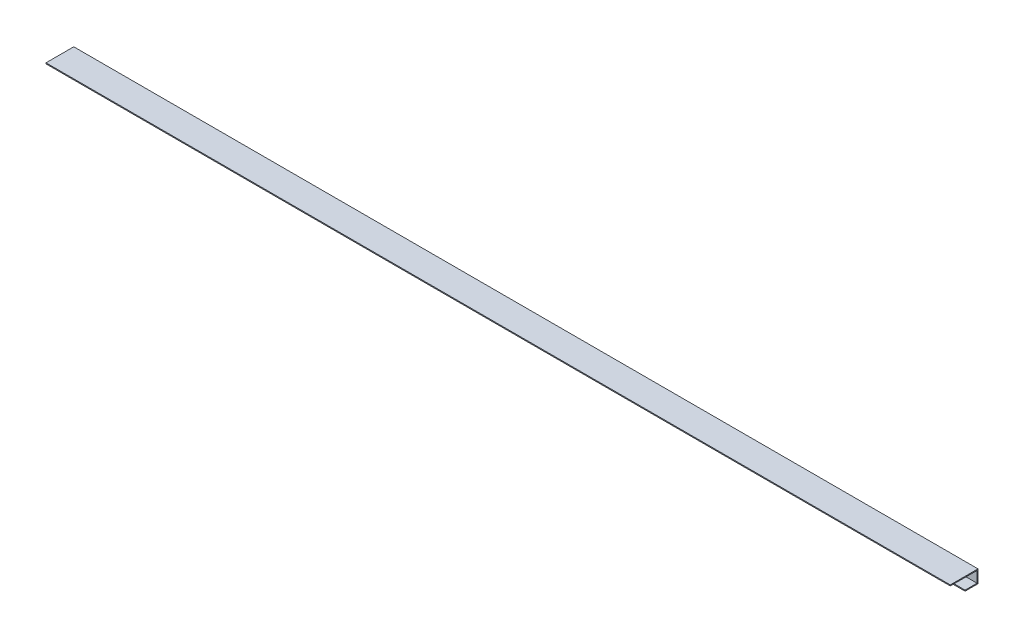
ISO-10303-21;
HEADER;
FILE_DESCRIPTION(('STEP AP214'),'2;1');
FILE_NAME('part.step','',(''),(''),'','','');
FILE_SCHEMA(('AUTOMOTIVE_DESIGN { 1 0 10303 214 1 1 1 1 }'));
ENDSEC;
DATA;
#1=APPLICATION_CONTEXT('core data for automotive mechanical design processes');
#2=APPLICATION_PROTOCOL_DEFINITION('international standard','automotive_design',2000,#1);
#3=PRODUCT_CONTEXT('',#1,'mechanical');
#4=PRODUCT('Part','Part','',(#3));
#5=PRODUCT_RELATED_PRODUCT_CATEGORY('part','',(#4));
#6=PRODUCT_DEFINITION_FORMATION('','',#4);
#7=PRODUCT_DEFINITION_CONTEXT('part definition',#1,'design');
#8=PRODUCT_DEFINITION('design','',#6,#7);
#9=PRODUCT_DEFINITION_SHAPE('','',#8);
#10=(LENGTH_UNIT() NAMED_UNIT(*) SI_UNIT(.MILLI.,.METRE.));
#11=(NAMED_UNIT(*) PLANE_ANGLE_UNIT() SI_UNIT($,.RADIAN.));
#12=(NAMED_UNIT(*) SI_UNIT($,.STERADIAN.) SOLID_ANGLE_UNIT());
#13=UNCERTAINTY_MEASURE_WITH_UNIT(LENGTH_MEASURE(1.E-05),#10,'distance_accuracy_value','');
#14=(GEOMETRIC_REPRESENTATION_CONTEXT(3) GLOBAL_UNCERTAINTY_ASSIGNED_CONTEXT((#13)) GLOBAL_UNIT_ASSIGNED_CONTEXT((#10,
#11,#12)) REPRESENTATION_CONTEXT('',''));
#15=CARTESIAN_POINT('',(0.,0.,0.));
#16=DIRECTION('',(0.,0.,1.));
#17=DIRECTION('',(1.,0.,0.));
#18=AXIS2_PLACEMENT_3D('',#15,#16,#17);
#19=CARTESIAN_POINT('',(1890.,0.,0.));
#20=DIRECTION('',(0.,0.,-1.));
#21=DIRECTION('',(-1.,0.,0.));
#22=AXIS2_PLACEMENT_3D('',#19,#20,#21);
#23=PLANE('',#22);
#24=DIRECTION('',(0.,-1.,0.));
#25=VECTOR('',#24,1.);
#26=CARTESIAN_POINT('',(0.,0.,0.));
#27=LINE('',#26,#25);
#28=CARTESIAN_POINT('',(0.,0.,0.));
#29=VERTEX_POINT('',#28);
#30=CARTESIAN_POINT('',(0.,-2.,0.));
#31=VERTEX_POINT('',#30);
#32=EDGE_CURVE('E129',#29,#31,#27,.T.);
#33=ORIENTED_EDGE('',*,*,#32,.T.);
#34=DIRECTION('',(-1.,0.,0.));
#35=VECTOR('',#34,1.);
#36=CARTESIAN_POINT('',(1890.,-2.,0.));
#37=LINE('',#36,#35);
#38=CARTESIAN_POINT('',(1890.,-2.,0.));
#39=VERTEX_POINT('',#38);
#40=EDGE_CURVE('E11',#39,#31,#37,.T.);
#41=ORIENTED_EDGE('',*,*,#40,.F.);
#42=DIRECTION('',(0.,-1.,0.));
#43=VECTOR('',#42,1.);
#44=CARTESIAN_POINT('',(1890.,0.,0.));
#45=LINE('',#44,#43);
#46=CARTESIAN_POINT('',(1890.,0.,0.));
#47=VERTEX_POINT('',#46);
#48=EDGE_CURVE('E143',#47,#39,#45,.T.);
#49=ORIENTED_EDGE('',*,*,#48,.F.);
#50=DIRECTION('',(-1.,0.,0.));
#51=VECTOR('',#50,1.);
#52=CARTESIAN_POINT('',(1890.,0.,0.));
#53=LINE('',#52,#51);
#54=EDGE_CURVE('E125',#47,#29,#53,.T.);
#55=ORIENTED_EDGE('',*,*,#54,.T.);
#56=EDGE_LOOP('',(#33,#41,#49,#55));
#57=FACE_BOUND('',#56,.T.);
#58=ADVANCED_FACE('F33',(#57),#23,.F.);
#59=CARTESIAN_POINT('',(1890.,-2.,0.));
#60=DIRECTION('',(0.,1.,0.));
#61=DIRECTION('',(0.,0.,1.));
#62=AXIS2_PLACEMENT_3D('',#59,#60,#61);
#63=PLANE('',#62);
#64=DIRECTION('',(0.,0.,-1.));
#65=VECTOR('',#64,1.);
#66=CARTESIAN_POINT('',(0.,-2.,0.));
#67=LINE('',#66,#65);
#68=CARTESIAN_POINT('',(0.,-2.,-56.));
#69=VERTEX_POINT('',#68);
#70=EDGE_CURVE('E132',#31,#69,#67,.T.);
#71=ORIENTED_EDGE('',*,*,#70,.T.);
#72=DIRECTION('',(-1.,0.,0.));
#73=VECTOR('',#72,1.);
#74=CARTESIAN_POINT('',(1890.,-2.,-56.));
#75=LINE('',#74,#73);
#76=CARTESIAN_POINT('',(1890.,-2.,-56.));
#77=VERTEX_POINT('',#76);
#78=EDGE_CURVE('E41',#77,#69,#75,.T.);
#79=ORIENTED_EDGE('',*,*,#78,.F.);
#80=DIRECTION('',(0.,0.,-1.));
#81=VECTOR('',#80,1.);
#82=CARTESIAN_POINT('',(1890.,-2.,0.));
#83=LINE('',#82,#81);
#84=EDGE_CURVE('E92',#39,#77,#83,.T.);
#85=ORIENTED_EDGE('',*,*,#84,.F.);
#86=ORIENTED_EDGE('',*,*,#40,.T.);
#87=EDGE_LOOP('',(#71,#79,#85,#86));
#88=FACE_BOUND('',#87,.T.);
#89=ADVANCED_FACE('F178',(#88),#63,.F.);
#90=CARTESIAN_POINT('',(1890.,-2.,-56.));
#91=DIRECTION('',(0.,0.,-1.));
#92=DIRECTION('',(-1.,0.,0.));
#93=AXIS2_PLACEMENT_3D('',#90,#91,#92);
#94=PLANE('',#93);
#95=DIRECTION('',(0.,-1.,0.));
#96=VECTOR('',#95,1.);
#97=CARTESIAN_POINT('',(0.,-2.,-56.));
#98=LINE('',#97,#96);
#99=CARTESIAN_POINT('',(0.,-25.,-56.));
#100=VERTEX_POINT('',#99);
#101=EDGE_CURVE('E134',#69,#100,#98,.T.);
#102=ORIENTED_EDGE('',*,*,#101,.T.);
#103=DIRECTION('',(-1.,0.,0.));
#104=VECTOR('',#103,1.);
#105=CARTESIAN_POINT('',(1890.,-25.,-56.));
#106=LINE('',#105,#104);
#107=CARTESIAN_POINT('',(1890.,-25.,-56.));
#108=VERTEX_POINT('',#107);
#109=EDGE_CURVE('E150',#108,#100,#106,.T.);
#110=ORIENTED_EDGE('',*,*,#109,.F.);
#111=DIRECTION('',(0.,-1.,0.));
#112=VECTOR('',#111,1.);
#113=CARTESIAN_POINT('',(1890.,-2.,-56.));
#114=LINE('',#113,#112);
#115=EDGE_CURVE('E158',#77,#108,#114,.T.);
#116=ORIENTED_EDGE('',*,*,#115,.F.);
#117=ORIENTED_EDGE('',*,*,#78,.T.);
#118=EDGE_LOOP('',(#102,#110,#116,#117));
#119=FACE_BOUND('',#118,.T.);
#120=ADVANCED_FACE('F156',(#119),#94,.F.);
#121=CARTESIAN_POINT('',(1890.,-25.,-56.));
#122=DIRECTION('',(0.,-1.,0.));
#123=DIRECTION('',(0.,0.,-1.));
#124=AXIS2_PLACEMENT_3D('',#121,#122,#123);
#125=PLANE('',#124);
#126=DIRECTION('',(0.,0.,1.));
#127=VECTOR('',#126,1.);
#128=CARTESIAN_POINT('',(0.,-25.,-56.));
#129=LINE('',#128,#127);
#130=CARTESIAN_POINT('',(0.,-25.,-31.));
#131=VERTEX_POINT('',#130);
#132=EDGE_CURVE('E136',#100,#131,#129,.T.);
#133=ORIENTED_EDGE('',*,*,#132,.T.);
#134=DIRECTION('',(-1.,0.,0.));
#135=VECTOR('',#134,1.);
#136=CARTESIAN_POINT('',(1890.,-25.,-31.));
#137=LINE('',#136,#135);
#138=CARTESIAN_POINT('',(1890.,-25.,-31.));
#139=VERTEX_POINT('',#138);
#140=EDGE_CURVE('E147',#139,#131,#137,.T.);
#141=ORIENTED_EDGE('',*,*,#140,.F.);
#142=DIRECTION('',(0.,0.,1.));
#143=VECTOR('',#142,1.);
#144=CARTESIAN_POINT('',(1890.,-25.,-56.));
#145=LINE('',#144,#143);
#146=EDGE_CURVE('E170',#108,#139,#145,.T.);
#147=ORIENTED_EDGE('',*,*,#146,.F.);
#148=ORIENTED_EDGE('',*,*,#109,.T.);
#149=EDGE_LOOP('',(#133,#141,#147,#148));
#150=FACE_BOUND('',#149,.T.);
#151=ADVANCED_FACE('F166',(#150),#125,.F.);
#152=CARTESIAN_POINT('',(1890.,-25.,-31.));
#153=DIRECTION('',(0.,0.,-1.));
#154=DIRECTION('',(-1.,0.,0.));
#155=AXIS2_PLACEMENT_3D('',#152,#153,#154);
#156=PLANE('',#155);
#157=DIRECTION('',(0.,-1.,0.));
#158=VECTOR('',#157,1.);
#159=CARTESIAN_POINT('',(0.,-25.,-31.));
#160=LINE('',#159,#158);
#161=CARTESIAN_POINT('',(0.,-27.,-31.));
#162=VERTEX_POINT('',#161);
#163=EDGE_CURVE('E138',#131,#162,#160,.T.);
#164=ORIENTED_EDGE('',*,*,#163,.T.);
#165=DIRECTION('',(-1.,0.,0.));
#166=VECTOR('',#165,1.);
#167=CARTESIAN_POINT('',(1890.,-27.,-31.));
#168=LINE('',#167,#166);
#169=CARTESIAN_POINT('',(1890.,-27.,-31.));
#170=VERTEX_POINT('',#169);
#171=EDGE_CURVE('E120',#170,#162,#168,.T.);
#172=ORIENTED_EDGE('',*,*,#171,.F.);
#173=DIRECTION('',(0.,-1.,0.));
#174=VECTOR('',#173,1.);
#175=CARTESIAN_POINT('',(1890.,-25.,-31.));
#176=LINE('',#175,#174);
#177=EDGE_CURVE('E111',#139,#170,#176,.T.);
#178=ORIENTED_EDGE('',*,*,#177,.F.);
#179=ORIENTED_EDGE('',*,*,#140,.T.);
#180=EDGE_LOOP('',(#164,#172,#178,#179));
#181=FACE_BOUND('',#180,.T.);
#182=ADVANCED_FACE('F169',(#181),#156,.F.);
#183=CARTESIAN_POINT('',(1890.,-27.,-58.));
#184=DIRECTION('',(0.,1.,0.));
#185=DIRECTION('',(0.,0.,1.));
#186=AXIS2_PLACEMENT_3D('',#183,#184,#185);
#187=PLANE('',#186);
#188=DIRECTION('',(0.,0.,-1.));
#189=VECTOR('',#188,1.);
#190=CARTESIAN_POINT('',(0.,-27.,-58.));
#191=LINE('',#190,#189);
#192=CARTESIAN_POINT('',(0.,-27.,-58.));
#193=VERTEX_POINT('',#192);
#194=EDGE_CURVE('E119',#162,#193,#191,.T.);
#195=ORIENTED_EDGE('',*,*,#194,.T.);
#196=DIRECTION('',(-1.,0.,0.));
#197=VECTOR('',#196,1.);
#198=CARTESIAN_POINT('',(1890.,-27.,-58.));
#199=LINE('',#198,#197);
#200=CARTESIAN_POINT('',(1890.,-27.,-58.));
#201=VERTEX_POINT('',#200);
#202=EDGE_CURVE('E116',#201,#193,#199,.T.);
#203=ORIENTED_EDGE('',*,*,#202,.F.);
#204=DIRECTION('',(0.,0.,-1.));
#205=VECTOR('',#204,1.);
#206=CARTESIAN_POINT('',(1890.,-27.,-58.));
#207=LINE('',#206,#205);
#208=EDGE_CURVE('E105',#170,#201,#207,.T.);
#209=ORIENTED_EDGE('',*,*,#208,.F.);
#210=ORIENTED_EDGE('',*,*,#171,.T.);
#211=EDGE_LOOP('',(#195,#203,#209,#210));
#212=FACE_BOUND('',#211,.T.);
#213=ADVANCED_FACE('F117',(#212),#187,.F.);
#214=CARTESIAN_POINT('',(1890.,0.,-58.));
#215=DIRECTION('',(0.,0.,1.));
#216=DIRECTION('',(1.,0.,0.));
#217=AXIS2_PLACEMENT_3D('',#214,#215,#216);
#218=PLANE('',#217);
#219=DIRECTION('',(0.,1.,0.));
#220=VECTOR('',#219,1.);
#221=CARTESIAN_POINT('',(0.,0.,-58.));
#222=LINE('',#221,#220);
#223=CARTESIAN_POINT('',(0.,0.,-58.));
#224=VERTEX_POINT('',#223);
#225=EDGE_CURVE('E78',#193,#224,#222,.T.);
#226=ORIENTED_EDGE('',*,*,#225,.T.);
#227=DIRECTION('',(-1.,0.,0.));
#228=VECTOR('',#227,1.);
#229=CARTESIAN_POINT('',(1890.,0.,-58.));
#230=LINE('',#229,#228);
#231=CARTESIAN_POINT('',(1890.,0.,-58.));
#232=VERTEX_POINT('',#231);
#233=EDGE_CURVE('E121',#232,#224,#230,.T.);
#234=ORIENTED_EDGE('',*,*,#233,.F.);
#235=DIRECTION('',(0.,1.,0.));
#236=VECTOR('',#235,1.);
#237=CARTESIAN_POINT('',(1890.,0.,-58.));
#238=LINE('',#237,#236);
#239=EDGE_CURVE('E109',#201,#232,#238,.T.);
#240=ORIENTED_EDGE('',*,*,#239,.F.);
#241=ORIENTED_EDGE('',*,*,#202,.T.);
#242=EDGE_LOOP('',(#226,#234,#240,#241));
#243=FACE_BOUND('',#242,.T.);
#244=ADVANCED_FACE('F123',(#243),#218,.F.);
#245=CARTESIAN_POINT('',(1890.,0.,0.));
#246=DIRECTION('',(0.,-1.,0.));
#247=DIRECTION('',(0.,0.,-1.));
#248=AXIS2_PLACEMENT_3D('',#245,#246,#247);
#249=PLANE('',#248);
#250=DIRECTION('',(0.,0.,1.));
#251=VECTOR('',#250,1.);
#252=CARTESIAN_POINT('',(0.,0.,0.));
#253=LINE('',#252,#251);
#254=EDGE_CURVE('E84',#224,#29,#253,.T.);
#255=ORIENTED_EDGE('',*,*,#254,.T.);
#256=ORIENTED_EDGE('',*,*,#54,.F.);
#257=DIRECTION('',(0.,0.,1.));
#258=VECTOR('',#257,1.);
#259=CARTESIAN_POINT('',(1890.,0.,0.));
#260=LINE('',#259,#258);
#261=EDGE_CURVE('E49',#232,#47,#260,.T.);
#262=ORIENTED_EDGE('',*,*,#261,.F.);
#263=ORIENTED_EDGE('',*,*,#233,.T.);
#264=EDGE_LOOP('',(#255,#256,#262,#263));
#265=FACE_BOUND('',#264,.T.);
#266=ADVANCED_FACE('F194',(#265),#249,.F.);
#267=CARTESIAN_POINT('',(1890.,0.,0.));
#268=DIRECTION('',(1.,0.,0.));
#269=DIRECTION('',(0.,0.,-1.));
#270=AXIS2_PLACEMENT_3D('',#267,#268,#269);
#271=PLANE('',#270);
#272=ORIENTED_EDGE('',*,*,#48,.T.);
#273=ORIENTED_EDGE('',*,*,#84,.T.);
#274=ORIENTED_EDGE('',*,*,#115,.T.);
#275=ORIENTED_EDGE('',*,*,#146,.T.);
#276=ORIENTED_EDGE('',*,*,#177,.T.);
#277=ORIENTED_EDGE('',*,*,#208,.T.);
#278=ORIENTED_EDGE('',*,*,#239,.T.);
#279=ORIENTED_EDGE('',*,*,#261,.T.);
#280=EDGE_LOOP('',(#272,#273,#274,#275,#276,#277,#278,#279));
#281=FACE_BOUND('',#280,.T.);
#282=ADVANCED_FACE('F107',(#281),#271,.T.);
#283=CARTESIAN_POINT('',(0.,0.,0.));
#284=DIRECTION('',(1.,0.,0.));
#285=DIRECTION('',(0.,0.,-1.));
#286=AXIS2_PLACEMENT_3D('',#283,#284,#285);
#287=PLANE('',#286);
#288=ORIENTED_EDGE('',*,*,#32,.F.);
#289=ORIENTED_EDGE('',*,*,#254,.F.);
#290=ORIENTED_EDGE('',*,*,#225,.F.);
#291=ORIENTED_EDGE('',*,*,#194,.F.);
#292=ORIENTED_EDGE('',*,*,#163,.F.);
#293=ORIENTED_EDGE('',*,*,#132,.F.);
#294=ORIENTED_EDGE('',*,*,#101,.F.);
#295=ORIENTED_EDGE('',*,*,#70,.F.);
#296=EDGE_LOOP('',(#288,#289,#290,#291,#292,#293,#294,#295));
#297=FACE_BOUND('',#296,.T.);
#298=ADVANCED_FACE('F162',(#297),#287,.F.);
#299=CLOSED_SHELL('',(#58,#89,#120,#151,#182,#213,#244,#266,#282,#298));
#300=MANIFOLD_SOLID_BREP('B2',#299);
#301=ADVANCED_BREP_SHAPE_REPRESENTATION('',(#18,#300),#14);
#302=SHAPE_DEFINITION_REPRESENTATION(#9,#301);
ENDSEC;
END-ISO-10303-21;
